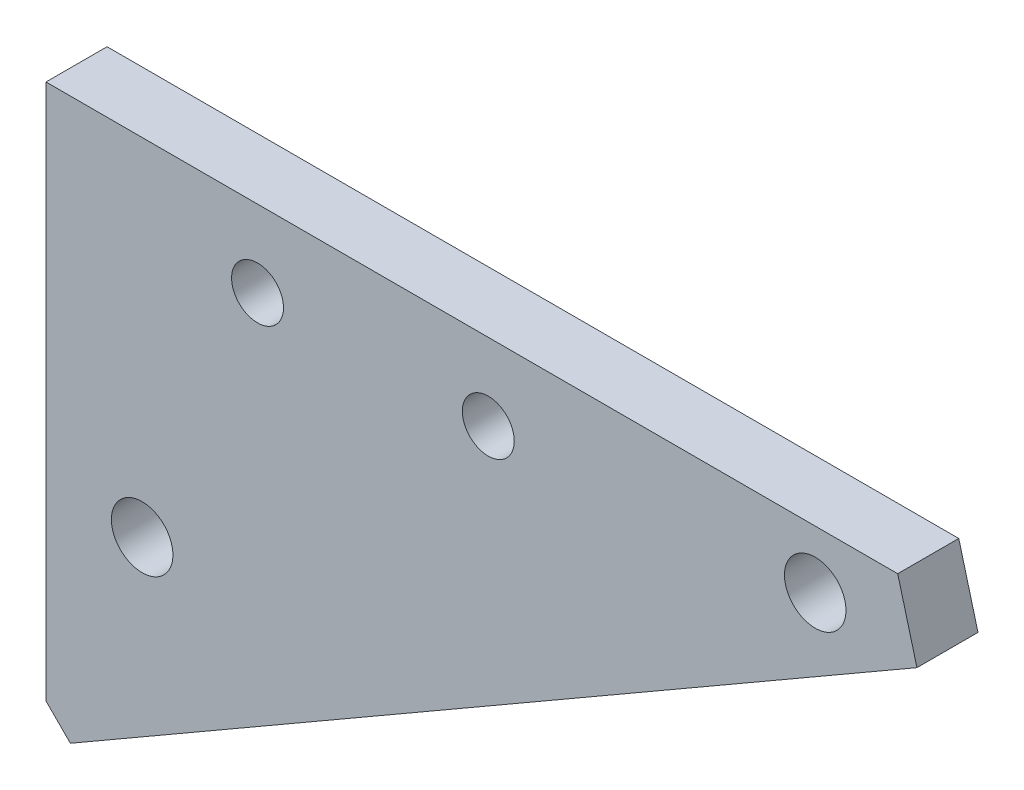
ISO-10303-21;
HEADER;
FILE_DESCRIPTION(('STEP AP214'),'2;1');
FILE_NAME('part.step','',(''),(''),'','','');
FILE_SCHEMA(('AUTOMOTIVE_DESIGN { 1 0 10303 214 1 1 1 1 }'));
ENDSEC;
DATA;
#1=APPLICATION_CONTEXT('core data for automotive mechanical design processes');
#2=APPLICATION_PROTOCOL_DEFINITION('international standard','automotive_design',2000,#1);
#3=PRODUCT_CONTEXT('',#1,'mechanical');
#4=PRODUCT('Part','Part','',(#3));
#5=PRODUCT_RELATED_PRODUCT_CATEGORY('part','',(#4));
#6=PRODUCT_DEFINITION_FORMATION('','',#4);
#7=PRODUCT_DEFINITION_CONTEXT('part definition',#1,'design');
#8=PRODUCT_DEFINITION('design','',#6,#7);
#9=PRODUCT_DEFINITION_SHAPE('','',#8);
#10=(LENGTH_UNIT() NAMED_UNIT(*) SI_UNIT(.MILLI.,.METRE.));
#11=(NAMED_UNIT(*) PLANE_ANGLE_UNIT() SI_UNIT($,.RADIAN.));
#12=(NAMED_UNIT(*) SI_UNIT($,.STERADIAN.) SOLID_ANGLE_UNIT());
#13=UNCERTAINTY_MEASURE_WITH_UNIT(LENGTH_MEASURE(1.E-05),#10,'distance_accuracy_value','');
#14=(GEOMETRIC_REPRESENTATION_CONTEXT(3) GLOBAL_UNCERTAINTY_ASSIGNED_CONTEXT((#13)) GLOBAL_UNIT_ASSIGNED_CONTEXT((#10,
#11,#12)) REPRESENTATION_CONTEXT('',''));
#15=CARTESIAN_POINT('',(0.,0.,0.));
#16=DIRECTION('',(0.,0.,1.));
#17=DIRECTION('',(1.,0.,0.));
#18=AXIS2_PLACEMENT_3D('',#15,#16,#17);
#19=CARTESIAN_POINT('',(17.,4.,3.175));
#20=DIRECTION('',(0.,-1.,0.));
#21=DIRECTION('',(0.,0.,-1.));
#22=AXIS2_PLACEMENT_3D('',#19,#20,#21);
#23=PLANE('',#22);
#24=DIRECTION('',(-1.,0.,0.));
#25=VECTOR('',#24,1.);
#26=CARTESIAN_POINT('',(34.7535207775812,4.,3.175));
#27=LINE('',#26,#25);
#28=CARTESIAN_POINT('',(27.2894191624434,4.,3.175));
#29=VERTEX_POINT('',#28);
#30=CARTESIAN_POINT('',(-17.,4.,3.175));
#31=VERTEX_POINT('',#30);
#32=EDGE_CURVE('E86',#29,#31,#27,.T.);
#33=ORIENTED_EDGE('',*,*,#32,.F.);
#34=DIRECTION('',(0.,0.,-1.));
#35=VECTOR('',#34,1.);
#36=CARTESIAN_POINT('',(27.2894191624434,4.,3.175));
#37=LINE('',#36,#35);
#38=CARTESIAN_POINT('',(27.2894191624434,4.,0.));
#39=VERTEX_POINT('',#38);
#40=EDGE_CURVE('E102',#29,#39,#37,.T.);
#41=ORIENTED_EDGE('',*,*,#40,.T.);
#42=DIRECTION('',(-1.,0.,0.));
#43=VECTOR('',#42,1.);
#44=CARTESIAN_POINT('',(17.,4.,0.));
#45=LINE('',#44,#43);
#46=CARTESIAN_POINT('',(-17.,4.,0.));
#47=VERTEX_POINT('',#46);
#48=EDGE_CURVE('E101',#39,#47,#45,.T.);
#49=ORIENTED_EDGE('',*,*,#48,.T.);
#50=DIRECTION('',(0.,0.,-1.));
#51=VECTOR('',#50,1.);
#52=CARTESIAN_POINT('',(-17.,4.,3.175));
#53=LINE('',#52,#51);
#54=EDGE_CURVE('E99',#31,#47,#53,.T.);
#55=ORIENTED_EDGE('',*,*,#54,.F.);
#56=EDGE_LOOP('',(#33,#41,#49,#55));
#57=FACE_BOUND('',#56,.T.);
#58=ADVANCED_FACE('F39',(#57),#23,.F.);
#59=CARTESIAN_POINT('',(-17.,4.,3.175));
#60=DIRECTION('',(1.,0.,0.));
#61=DIRECTION('',(0.,1.,0.));
#62=AXIS2_PLACEMENT_3D('',#59,#60,#61);
#63=PLANE('',#62);
#64=DIRECTION('',(0.,-1.,0.));
#65=VECTOR('',#64,1.);
#66=CARTESIAN_POINT('',(-17.,4.,0.));
#67=LINE('',#66,#65);
#68=CARTESIAN_POINT('',(-17.,-23.879909152447,0.));
#69=VERTEX_POINT('',#68);
#70=EDGE_CURVE('E111',#47,#69,#67,.T.);
#71=ORIENTED_EDGE('',*,*,#70,.T.);
#72=DIRECTION('',(0.,0.,1.));
#73=VECTOR('',#72,1.);
#74=CARTESIAN_POINT('',(-17.,-23.879909152447,3.175));
#75=LINE('',#74,#73);
#76=CARTESIAN_POINT('',(-17.,-23.879909152447,3.175));
#77=VERTEX_POINT('',#76);
#78=EDGE_CURVE('E48',#69,#77,#75,.T.);
#79=ORIENTED_EDGE('',*,*,#78,.T.);
#80=DIRECTION('',(0.,-1.,0.));
#81=VECTOR('',#80,1.);
#82=CARTESIAN_POINT('',(-17.,4.,3.175));
#83=LINE('',#82,#81);
#84=EDGE_CURVE('E89',#31,#77,#83,.T.);
#85=ORIENTED_EDGE('',*,*,#84,.F.);
#86=ORIENTED_EDGE('',*,*,#54,.T.);
#87=EDGE_LOOP('',(#71,#79,#85,#86));
#88=FACE_BOUND('',#87,.T.);
#89=ADVANCED_FACE('F105',(#88),#63,.F.);
#90=CARTESIAN_POINT('',(-17.,-25.879909152447,3.175));
#91=DIRECTION('',(-0.499999999999995,0.866025403784441,0.));
#92=DIRECTION('',(-0.866025403784442,-0.499999999999995,0.));
#93=AXIS2_PLACEMENT_3D('',#90,#91,#92);
#94=PLANE('',#93);
#95=DIRECTION('',(0.866025403784441,0.499999999999995,0.));
#96=VECTOR('',#95,1.);
#97=CARTESIAN_POINT('',(-17.,-25.879909152447,3.175));
#98=LINE('',#97,#96);
#99=CARTESIAN_POINT('',(-15.7320508075689,-25.1478583448781,3.175));
#100=VERTEX_POINT('',#99);
#101=CARTESIAN_POINT('',(28.2894191624434,0.267949192431116,3.175));
#102=VERTEX_POINT('',#101);
#103=EDGE_CURVE('E103',#100,#102,#98,.T.);
#104=ORIENTED_EDGE('',*,*,#103,.F.);
#105=DIRECTION('',(0.,0.,-1.));
#106=VECTOR('',#105,1.);
#107=CARTESIAN_POINT('',(-15.7320508075689,-25.1478583448781,3.175));
#108=LINE('',#107,#106);
#109=CARTESIAN_POINT('',(-15.7320508075689,-25.1478583448781,0.));
#110=VERTEX_POINT('',#109);
#111=EDGE_CURVE('E123',#100,#110,#108,.T.);
#112=ORIENTED_EDGE('',*,*,#111,.T.);
#113=DIRECTION('',(0.866025403784441,0.499999999999995,0.));
#114=VECTOR('',#113,1.);
#115=CARTESIAN_POINT('',(-17.,-25.879909152447,0.));
#116=LINE('',#115,#114);
#117=CARTESIAN_POINT('',(28.2894191624434,0.267949192431116,0.));
#118=VERTEX_POINT('',#117);
#119=EDGE_CURVE('E96',#110,#118,#116,.T.);
#120=ORIENTED_EDGE('',*,*,#119,.T.);
#121=DIRECTION('',(0.,0.,1.));
#122=VECTOR('',#121,1.);
#123=CARTESIAN_POINT('',(28.2894191624434,0.26794919243112,3.175));
#124=LINE('',#123,#122);
#125=EDGE_CURVE('E119',#118,#102,#124,.T.);
#126=ORIENTED_EDGE('',*,*,#125,.T.);
#127=EDGE_LOOP('',(#104,#112,#120,#126));
#128=FACE_BOUND('',#127,.T.);
#129=ADVANCED_FACE('F129',(#128),#94,.F.);
#130=CARTESIAN_POINT('',(0.,0.,3.175));
#131=DIRECTION('',(0.,0.,1.));
#132=DIRECTION('',(1.,0.,0.));
#133=AXIS2_PLACEMENT_3D('',#130,#131,#132);
#134=PLANE('',#133);
#135=CARTESIAN_POINT('',(23.,1.,3.175));
#136=DIRECTION('',(0.,0.,-1.));
#137=DIRECTION('',(-1.,0.,0.));
#138=AXIS2_PLACEMENT_3D('',#135,#136,#137);
#139=CIRCLE('',#138,1.6);
#140=CARTESIAN_POINT('',(21.4,1.,3.175));
#141=VERTEX_POINT('',#140);
#142=EDGE_CURVE('E175',#141,#141,#139,.T.);
#143=ORIENTED_EDGE('',*,*,#142,.T.);
#144=EDGE_LOOP('',(#143));
#145=FACE_BOUND('',#144,.T.);
#146=CARTESIAN_POINT('',(-12.,-14.,3.175));
#147=DIRECTION('',(0.,0.,-1.));
#148=DIRECTION('',(-1.,0.,0.));
#149=AXIS2_PLACEMENT_3D('',#146,#147,#148);
#150=CIRCLE('',#149,1.6);
#151=CARTESIAN_POINT('',(-13.6,-14.,3.175));
#152=VERTEX_POINT('',#151);
#153=EDGE_CURVE('E185',#152,#152,#150,.T.);
#154=ORIENTED_EDGE('',*,*,#153,.T.);
#155=EDGE_LOOP('',(#154));
#156=FACE_BOUND('',#155,.T.);
#157=CARTESIAN_POINT('',(-6.,0.,3.175));
#158=DIRECTION('',(0.,0.,1.));
#159=DIRECTION('',(1.,0.,0.));
#160=AXIS2_PLACEMENT_3D('',#157,#158,#159);
#161=CIRCLE('',#160,1.34999999999999);
#162=CARTESIAN_POINT('',(-4.65000000000001,0.,3.175));
#163=VERTEX_POINT('',#162);
#164=EDGE_CURVE('E188',#163,#163,#161,.T.);
#165=ORIENTED_EDGE('',*,*,#164,.F.);
#166=EDGE_LOOP('',(#165));
#167=FACE_BOUND('',#166,.T.);
#168=CARTESIAN_POINT('',(6.,0.,3.175));
#169=DIRECTION('',(0.,0.,1.));
#170=DIRECTION('',(1.,0.,0.));
#171=AXIS2_PLACEMENT_3D('',#168,#169,#170);
#172=CIRCLE('',#171,1.34999999999999);
#173=CARTESIAN_POINT('',(7.34999999999999,0.,3.175));
#174=VERTEX_POINT('',#173);
#175=EDGE_CURVE('E194',#174,#174,#172,.T.);
#176=ORIENTED_EDGE('',*,*,#175,.F.);
#177=EDGE_LOOP('',(#176));
#178=FACE_BOUND('',#177,.T.);
#179=ORIENTED_EDGE('',*,*,#84,.T.);
#180=DIRECTION('',(-0.707106781186545,0.70710678118655,0.));
#181=VECTOR('',#180,1.);
#182=CARTESIAN_POINT('',(-20.4399545762236,-20.4399545762234,3.175));
#183=LINE('',#182,#181);
#184=EDGE_CURVE('E13',#77,#100,#183,.F.);
#185=ORIENTED_EDGE('',*,*,#184,.T.);
#186=ORIENTED_EDGE('',*,*,#103,.T.);
#187=DIRECTION('',(0.258819045102518,-0.965925826289069,0.));
#188=VECTOR('',#187,1.);
#189=CARTESIAN_POINT('',(26.4613747058206,7.0903039830419,3.175));
#190=LINE('',#189,#188);
#191=EDGE_CURVE('E92',#102,#29,#190,.F.);
#192=ORIENTED_EDGE('',*,*,#191,.T.);
#193=ORIENTED_EDGE('',*,*,#32,.T.);
#194=EDGE_LOOP('',(#179,#185,#186,#192,#193));
#195=FACE_BOUND('',#194,.T.);
#196=ADVANCED_FACE('F88',(#145,#156,#167,#178,#195),#134,.T.);
#197=CARTESIAN_POINT('',(0.,0.,0.));
#198=DIRECTION('',(0.,0.,1.));
#199=DIRECTION('',(1.,0.,0.));
#200=AXIS2_PLACEMENT_3D('',#197,#198,#199);
#201=PLANE('',#200);
#202=CARTESIAN_POINT('',(23.,1.,0.));
#203=DIRECTION('',(0.,0.,-1.));
#204=DIRECTION('',(-1.,0.,0.));
#205=AXIS2_PLACEMENT_3D('',#202,#203,#204);
#206=CIRCLE('',#205,1.6);
#207=CARTESIAN_POINT('',(21.4,1.,0.));
#208=VERTEX_POINT('',#207);
#209=EDGE_CURVE('E178',#208,#208,#206,.T.);
#210=ORIENTED_EDGE('',*,*,#209,.F.);
#211=EDGE_LOOP('',(#210));
#212=FACE_BOUND('',#211,.T.);
#213=CARTESIAN_POINT('',(-12.,-14.,0.));
#214=DIRECTION('',(0.,0.,-1.));
#215=DIRECTION('',(-1.,0.,0.));
#216=AXIS2_PLACEMENT_3D('',#213,#214,#215);
#217=CIRCLE('',#216,1.6);
#218=CARTESIAN_POINT('',(-13.6,-14.,0.));
#219=VERTEX_POINT('',#218);
#220=EDGE_CURVE('E180',#219,#219,#217,.T.);
#221=ORIENTED_EDGE('',*,*,#220,.F.);
#222=EDGE_LOOP('',(#221));
#223=FACE_BOUND('',#222,.T.);
#224=CARTESIAN_POINT('',(-6.,0.,0.));
#225=DIRECTION('',(0.,0.,1.));
#226=DIRECTION('',(1.,0.,0.));
#227=AXIS2_PLACEMENT_3D('',#224,#225,#226);
#228=CIRCLE('',#227,1.35);
#229=CARTESIAN_POINT('',(-4.65,0.,0.));
#230=VERTEX_POINT('',#229);
#231=EDGE_CURVE('E191',#230,#230,#228,.T.);
#232=ORIENTED_EDGE('',*,*,#231,.T.);
#233=EDGE_LOOP('',(#232));
#234=FACE_BOUND('',#233,.T.);
#235=CARTESIAN_POINT('',(6.,0.,0.));
#236=DIRECTION('',(0.,0.,1.));
#237=DIRECTION('',(1.,0.,0.));
#238=AXIS2_PLACEMENT_3D('',#235,#236,#237);
#239=CIRCLE('',#238,1.35);
#240=CARTESIAN_POINT('',(7.35,0.,0.));
#241=VERTEX_POINT('',#240);
#242=EDGE_CURVE('E112',#241,#241,#239,.T.);
#243=ORIENTED_EDGE('',*,*,#242,.T.);
#244=EDGE_LOOP('',(#243));
#245=FACE_BOUND('',#244,.T.);
#246=ORIENTED_EDGE('',*,*,#119,.F.);
#247=DIRECTION('',(0.707106781186545,-0.70710678118655,0.));
#248=VECTOR('',#247,1.);
#249=CARTESIAN_POINT('',(-15.7320508075689,-25.1478583448781,0.));
#250=LINE('',#249,#248);
#251=EDGE_CURVE('E62',#110,#69,#250,.F.);
#252=ORIENTED_EDGE('',*,*,#251,.T.);
#253=ORIENTED_EDGE('',*,*,#70,.F.);
#254=ORIENTED_EDGE('',*,*,#48,.F.);
#255=DIRECTION('',(-0.258819045102518,0.965925826289069,0.));
#256=VECTOR('',#255,1.);
#257=CARTESIAN_POINT('',(27.2894191624434,4.,0.));
#258=LINE('',#257,#256);
#259=EDGE_CURVE('E116',#39,#118,#258,.F.);
#260=ORIENTED_EDGE('',*,*,#259,.T.);
#261=EDGE_LOOP('',(#246,#252,#253,#254,#260));
#262=FACE_BOUND('',#261,.T.);
#263=ADVANCED_FACE('F131',(#212,#223,#234,#245,#262),#201,.F.);
#264=CARTESIAN_POINT('',(6.,0.,3.175));
#265=DIRECTION('',(0.,0.,1.));
#266=DIRECTION('',(1.,0.,0.));
#267=AXIS2_PLACEMENT_3D('',#264,#265,#266);
#268=CYLINDRICAL_SURFACE('',#267,1.34999999999999);
#269=ORIENTED_EDGE('',*,*,#242,.F.);
#270=EDGE_LOOP('',(#269));
#271=FACE_BOUND('',#270,.T.);
#272=ORIENTED_EDGE('',*,*,#175,.T.);
#273=EDGE_LOOP('',(#272));
#274=FACE_BOUND('',#273,.T.);
#275=ADVANCED_FACE('F142',(#271,#274),#268,.F.);
#276=CARTESIAN_POINT('',(-6.,0.,3.175));
#277=DIRECTION('',(0.,0.,1.));
#278=DIRECTION('',(1.,0.,0.));
#279=AXIS2_PLACEMENT_3D('',#276,#277,#278);
#280=CYLINDRICAL_SURFACE('',#279,1.34999999999999);
#281=ORIENTED_EDGE('',*,*,#231,.F.);
#282=EDGE_LOOP('',(#281));
#283=FACE_BOUND('',#282,.T.);
#284=ORIENTED_EDGE('',*,*,#164,.T.);
#285=EDGE_LOOP('',(#284));
#286=FACE_BOUND('',#285,.T.);
#287=ADVANCED_FACE('F136',(#283,#286),#280,.F.);
#288=CARTESIAN_POINT('',(27.2894191624434,4.,3.175));
#289=DIRECTION('',(-0.965925826289069,-0.258819045102518,0.));
#290=DIRECTION('',(0.,0.,-1.));
#291=AXIS2_PLACEMENT_3D('',#288,#289,#290);
#292=PLANE('',#291);
#293=ORIENTED_EDGE('',*,*,#191,.F.);
#294=ORIENTED_EDGE('',*,*,#125,.F.);
#295=ORIENTED_EDGE('',*,*,#259,.F.);
#296=ORIENTED_EDGE('',*,*,#40,.F.);
#297=EDGE_LOOP('',(#293,#294,#295,#296));
#298=FACE_BOUND('',#297,.T.);
#299=ADVANCED_FACE('F134',(#298),#292,.F.);
#300=CARTESIAN_POINT('',(-15.7320508075689,-25.1478583448781,3.175));
#301=DIRECTION('',(0.70710678118655,0.707106781186545,0.));
#302=DIRECTION('',(0.,0.,-1.));
#303=AXIS2_PLACEMENT_3D('',#300,#301,#302);
#304=PLANE('',#303);
#305=ORIENTED_EDGE('',*,*,#184,.F.);
#306=ORIENTED_EDGE('',*,*,#78,.F.);
#307=ORIENTED_EDGE('',*,*,#251,.F.);
#308=ORIENTED_EDGE('',*,*,#111,.F.);
#309=EDGE_LOOP('',(#305,#306,#307,#308));
#310=FACE_BOUND('',#309,.T.);
#311=ADVANCED_FACE('F42',(#310),#304,.F.);
#312=CARTESIAN_POINT('',(-12.,-14.,0.));
#313=DIRECTION('',(0.,0.,-1.));
#314=DIRECTION('',(-1.,0.,0.));
#315=AXIS2_PLACEMENT_3D('',#312,#313,#314);
#316=CYLINDRICAL_SURFACE('',#315,1.6);
#317=ORIENTED_EDGE('',*,*,#153,.F.);
#318=EDGE_LOOP('',(#317));
#319=FACE_BOUND('',#318,.T.);
#320=ORIENTED_EDGE('',*,*,#220,.T.);
#321=EDGE_LOOP('',(#320));
#322=FACE_BOUND('',#321,.T.);
#323=ADVANCED_FACE('F141',(#319,#322),#316,.F.);
#324=CARTESIAN_POINT('',(23.,1.,0.));
#325=DIRECTION('',(0.,0.,-1.));
#326=DIRECTION('',(-1.,0.,0.));
#327=AXIS2_PLACEMENT_3D('',#324,#325,#326);
#328=CYLINDRICAL_SURFACE('',#327,1.6);
#329=ORIENTED_EDGE('',*,*,#142,.F.);
#330=EDGE_LOOP('',(#329));
#331=FACE_BOUND('',#330,.T.);
#332=ORIENTED_EDGE('',*,*,#209,.T.);
#333=EDGE_LOOP('',(#332));
#334=FACE_BOUND('',#333,.T.);
#335=ADVANCED_FACE('F166',(#331,#334),#328,.F.);
#336=CLOSED_SHELL('',(#58,#89,#129,#196,#263,#275,#287,#299,#311,#323,#335));
#337=MANIFOLD_SOLID_BREP('B2',#336);
#338=ADVANCED_BREP_SHAPE_REPRESENTATION('',(#18,#337),#14);
#339=SHAPE_DEFINITION_REPRESENTATION(#9,#338);
ENDSEC;
END-ISO-10303-21;
